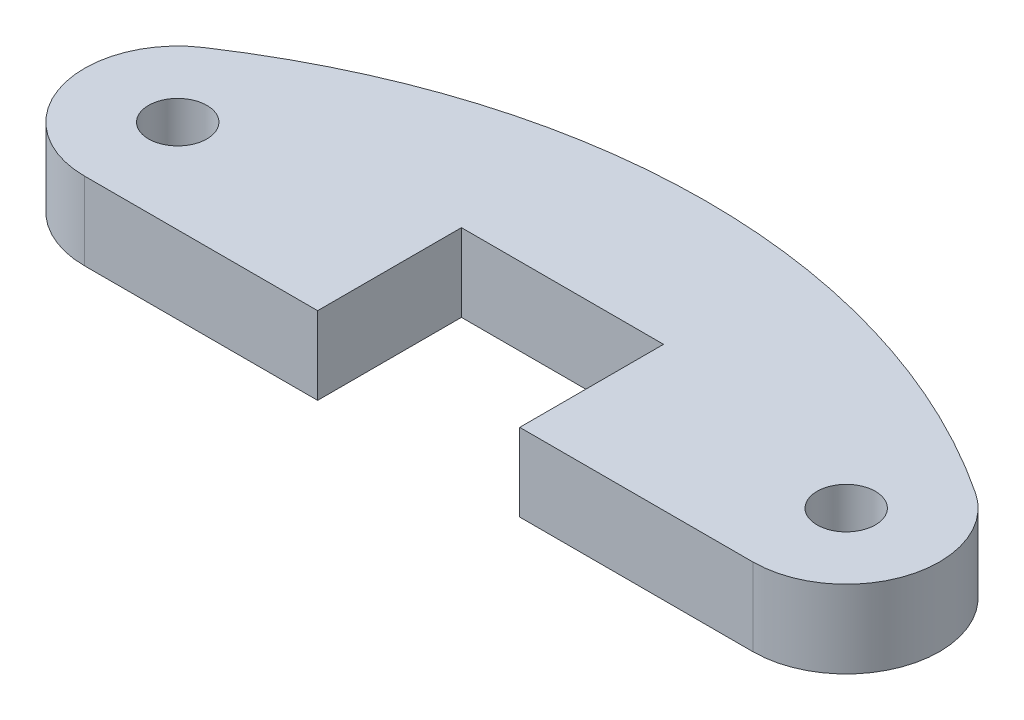
ISO-10303-21;
HEADER;
FILE_DESCRIPTION(('STEP AP214'),'2;1');
FILE_NAME('part.step','',(''),(''),'','','');
FILE_SCHEMA(('AUTOMOTIVE_DESIGN { 1 0 10303 214 1 1 1 1 }'));
ENDSEC;
DATA;
#1=APPLICATION_CONTEXT('core data for automotive mechanical design processes');
#2=APPLICATION_PROTOCOL_DEFINITION('international standard','automotive_design',2000,#1);
#3=PRODUCT_CONTEXT('',#1,'mechanical');
#4=PRODUCT('Part','Part','',(#3));
#5=PRODUCT_RELATED_PRODUCT_CATEGORY('part','',(#4));
#6=PRODUCT_DEFINITION_FORMATION('','',#4);
#7=PRODUCT_DEFINITION_CONTEXT('part definition',#1,'design');
#8=PRODUCT_DEFINITION('design','',#6,#7);
#9=PRODUCT_DEFINITION_SHAPE('','',#8);
#10=(LENGTH_UNIT() NAMED_UNIT(*) SI_UNIT(.MILLI.,.METRE.));
#11=(NAMED_UNIT(*) PLANE_ANGLE_UNIT() SI_UNIT($,.RADIAN.));
#12=(NAMED_UNIT(*) SI_UNIT($,.STERADIAN.) SOLID_ANGLE_UNIT());
#13=UNCERTAINTY_MEASURE_WITH_UNIT(LENGTH_MEASURE(1.E-05),#10,'distance_accuracy_value','');
#14=(GEOMETRIC_REPRESENTATION_CONTEXT(3) GLOBAL_UNCERTAINTY_ASSIGNED_CONTEXT((#13)) GLOBAL_UNIT_ASSIGNED_CONTEXT((#10,
#11,#12)) REPRESENTATION_CONTEXT('',''));
#15=CARTESIAN_POINT('',(0.,0.,0.));
#16=DIRECTION('',(0.,0.,1.));
#17=DIRECTION('',(1.,0.,0.));
#18=AXIS2_PLACEMENT_3D('',#15,#16,#17);
#19=CARTESIAN_POINT('',(21.5,5.,0.));
#20=DIRECTION('',(0.,1.,0.));
#21=DIRECTION('',(0.,0.,1.));
#22=AXIS2_PLACEMENT_3D('',#19,#20,#21);
#23=PLANE('',#22);
#24=CARTESIAN_POINT('',(-21.5,5.,0.));
#25=DIRECTION('',(0.,1.,0.));
#26=DIRECTION('',(0.,0.,1.));
#27=AXIS2_PLACEMENT_3D('',#24,#25,#26);
#28=CIRCLE('',#27,1.875);
#29=CARTESIAN_POINT('',(-21.5,5.,1.87500000000003));
#30=VERTEX_POINT('',#29);
#31=EDGE_CURVE('E146',#30,#30,#28,.T.);
#32=ORIENTED_EDGE('',*,*,#31,.F.);
#33=EDGE_LOOP('',(#32));
#34=FACE_BOUND('',#33,.T.);
#35=CARTESIAN_POINT('',(21.5,5.,0.));
#36=DIRECTION('',(0.,1.,0.));
#37=DIRECTION('',(0.,0.,1.));
#38=AXIS2_PLACEMENT_3D('',#35,#36,#37);
#39=CIRCLE('',#38,6.00000000000001);
#40=CARTESIAN_POINT('',(21.5,5.,6.00000000000002));
#41=VERTEX_POINT('',#40);
#42=CARTESIAN_POINT('',(24.8166247903554,5.,-5.));
#43=VERTEX_POINT('',#42);
#44=EDGE_CURVE('E170',#41,#43,#39,.T.);
#45=ORIENTED_EDGE('',*,*,#44,.T.);
#46=CARTESIAN_POINT('',(24.8166247903554,5.,-5.));
#47=CARTESIAN_POINT('',(10.3785852581471,5.,-14.5771119673307));
#48=CARTESIAN_POINT('',(-8.73629512344241,5.,-15.6664840020742));
#49=CARTESIAN_POINT('',(-24.8166247903554,5.,-5.));
#50=B_SPLINE_CURVE_WITH_KNOTS('',3,(#46,#47,#48,#49),.UNSPECIFIED.,.F.,.F.,(4,4),(0.,1.),.UNSPECIFIED.);
#51=CARTESIAN_POINT('',(-24.8166247903554,5.,-4.99999999999999));
#52=VERTEX_POINT('',#51);
#53=EDGE_CURVE('E99',#43,#52,#50,.T.);
#54=ORIENTED_EDGE('',*,*,#53,.T.);
#55=CARTESIAN_POINT('',(-21.5,5.,0.));
#56=DIRECTION('',(0.,1.,0.));
#57=DIRECTION('',(0.,0.,1.));
#58=AXIS2_PLACEMENT_3D('',#55,#56,#57);
#59=CIRCLE('',#58,6.00000000000001);
#60=CARTESIAN_POINT('',(-21.5,5.,6.00000000000003));
#61=VERTEX_POINT('',#60);
#62=EDGE_CURVE('E191',#52,#61,#59,.T.);
#63=ORIENTED_EDGE('',*,*,#62,.T.);
#64=DIRECTION('',(1.,0.,0.));
#65=VECTOR('',#64,1.);
#66=CARTESIAN_POINT('',(-6.5,5.,6.00000000000002));
#67=LINE('',#66,#65);
#68=CARTESIAN_POINT('',(-6.5,5.,6.00000000000002));
#69=VERTEX_POINT('',#68);
#70=EDGE_CURVE('E204',#61,#69,#67,.T.);
#71=ORIENTED_EDGE('',*,*,#70,.T.);
#72=DIRECTION('',(0.,0.,-1.));
#73=VECTOR('',#72,1.);
#74=CARTESIAN_POINT('',(-6.5,5.,3.25));
#75=LINE('',#74,#73);
#76=CARTESIAN_POINT('',(-6.5,5.,-3.25));
#77=VERTEX_POINT('',#76);
#78=EDGE_CURVE('E118',#69,#77,#75,.T.);
#79=ORIENTED_EDGE('',*,*,#78,.T.);
#80=DIRECTION('',(1.,0.,0.));
#81=VECTOR('',#80,1.);
#82=CARTESIAN_POINT('',(6.5,5.,-3.25));
#83=LINE('',#82,#81);
#84=CARTESIAN_POINT('',(6.5,5.,-3.25));
#85=VERTEX_POINT('',#84);
#86=EDGE_CURVE('E112',#77,#85,#83,.T.);
#87=ORIENTED_EDGE('',*,*,#86,.T.);
#88=DIRECTION('',(0.,0.,1.));
#89=VECTOR('',#88,1.);
#90=CARTESIAN_POINT('',(6.5,5.,3.25));
#91=LINE('',#90,#89);
#92=CARTESIAN_POINT('',(6.5,5.,6.00000000000002));
#93=VERTEX_POINT('',#92);
#94=EDGE_CURVE('E116',#85,#93,#91,.T.);
#95=ORIENTED_EDGE('',*,*,#94,.T.);
#96=DIRECTION('',(1.,0.,0.));
#97=VECTOR('',#96,1.);
#98=CARTESIAN_POINT('',(21.5,5.,6.00000000000002));
#99=LINE('',#98,#97);
#100=EDGE_CURVE('E57',#93,#41,#99,.T.);
#101=ORIENTED_EDGE('',*,*,#100,.T.);
#102=EDGE_LOOP('',(#45,#54,#63,#71,#79,#87,#95,#101));
#103=FACE_BOUND('',#102,.T.);
#104=CARTESIAN_POINT('',(21.5,5.,0.));
#105=DIRECTION('',(0.,1.,0.));
#106=DIRECTION('',(0.,0.,-1.));
#107=AXIS2_PLACEMENT_3D('',#104,#105,#106);
#108=CIRCLE('',#107,1.875);
#109=CARTESIAN_POINT('',(21.5,5.,-1.87499999999997));
#110=VERTEX_POINT('',#109);
#111=EDGE_CURVE('E252',#110,#110,#108,.T.);
#112=ORIENTED_EDGE('',*,*,#111,.F.);
#113=EDGE_LOOP('',(#112));
#114=FACE_BOUND('',#113,.T.);
#115=ADVANCED_FACE('F39',(#34,#103,#114),#23,.T.);
#116=CARTESIAN_POINT('',(21.5,0.,0.));
#117=DIRECTION('',(0.,1.,0.));
#118=DIRECTION('',(0.,0.,1.));
#119=AXIS2_PLACEMENT_3D('',#116,#117,#118);
#120=PLANE('',#119);
#121=CARTESIAN_POINT('',(21.5,0.,0.));
#122=DIRECTION('',(0.,1.,0.));
#123=DIRECTION('',(0.,0.,1.));
#124=AXIS2_PLACEMENT_3D('',#121,#122,#123);
#125=CIRCLE('',#124,6.00000000000001);
#126=CARTESIAN_POINT('',(21.5,0.,6.00000000000002));
#127=VERTEX_POINT('',#126);
#128=CARTESIAN_POINT('',(24.8166247903554,0.,-5.));
#129=VERTEX_POINT('',#128);
#130=EDGE_CURVE('E141',#127,#129,#125,.T.);
#131=ORIENTED_EDGE('',*,*,#130,.F.);
#132=DIRECTION('',(1.,0.,0.));
#133=VECTOR('',#132,1.);
#134=CARTESIAN_POINT('',(21.5,0.,6.00000000000002));
#135=LINE('',#134,#133);
#136=CARTESIAN_POINT('',(6.5,0.,6.00000000000002));
#137=VERTEX_POINT('',#136);
#138=EDGE_CURVE('E91',#137,#127,#135,.T.);
#139=ORIENTED_EDGE('',*,*,#138,.F.);
#140=DIRECTION('',(0.,0.,1.));
#141=VECTOR('',#140,1.);
#142=CARTESIAN_POINT('',(6.5,0.,3.25));
#143=LINE('',#142,#141);
#144=CARTESIAN_POINT('',(6.5,0.,-3.25));
#145=VERTEX_POINT('',#144);
#146=EDGE_CURVE('E85',#145,#137,#143,.T.);
#147=ORIENTED_EDGE('',*,*,#146,.F.);
#148=DIRECTION('',(1.,0.,0.));
#149=VECTOR('',#148,1.);
#150=CARTESIAN_POINT('',(6.5,0.,-3.25));
#151=LINE('',#150,#149);
#152=CARTESIAN_POINT('',(-6.5,0.,-3.25));
#153=VERTEX_POINT('',#152);
#154=EDGE_CURVE('E128',#153,#145,#151,.T.);
#155=ORIENTED_EDGE('',*,*,#154,.F.);
#156=DIRECTION('',(0.,0.,-1.));
#157=VECTOR('',#156,1.);
#158=CARTESIAN_POINT('',(-6.5,0.,3.25));
#159=LINE('',#158,#157);
#160=CARTESIAN_POINT('',(-6.5,0.,6.00000000000002));
#161=VERTEX_POINT('',#160);
#162=EDGE_CURVE('E161',#161,#153,#159,.T.);
#163=ORIENTED_EDGE('',*,*,#162,.F.);
#164=DIRECTION('',(1.,0.,0.));
#165=VECTOR('',#164,1.);
#166=CARTESIAN_POINT('',(-6.5,0.,6.00000000000002));
#167=LINE('',#166,#165);
#168=CARTESIAN_POINT('',(-21.5,0.,6.00000000000003));
#169=VERTEX_POINT('',#168);
#170=EDGE_CURVE('E157',#169,#161,#167,.T.);
#171=ORIENTED_EDGE('',*,*,#170,.F.);
#172=CARTESIAN_POINT('',(-21.5,0.,0.));
#173=DIRECTION('',(0.,1.,0.));
#174=DIRECTION('',(0.,0.,1.));
#175=AXIS2_PLACEMENT_3D('',#172,#173,#174);
#176=CIRCLE('',#175,6.00000000000001);
#177=CARTESIAN_POINT('',(-24.8166247903554,0.,-4.99999999999999));
#178=VERTEX_POINT('',#177);
#179=EDGE_CURVE('E151',#178,#169,#176,.T.);
#180=ORIENTED_EDGE('',*,*,#179,.F.);
#181=CARTESIAN_POINT('',(24.8166247903554,0.,-5.));
#182=CARTESIAN_POINT('',(10.3785852581471,0.,-14.5771119673307));
#183=CARTESIAN_POINT('',(-8.73629512344241,0.,-15.6664840020742));
#184=CARTESIAN_POINT('',(-24.8166247903554,0.,-5.));
#185=B_SPLINE_CURVE_WITH_KNOTS('',3,(#181,#182,#183,#184),.UNSPECIFIED.,.F.,.F.,(4,4),(0.,1.),.UNSPECIFIED.);
#186=EDGE_CURVE('E145',#129,#178,#185,.T.);
#187=ORIENTED_EDGE('',*,*,#186,.F.);
#188=EDGE_LOOP('',(#131,#139,#147,#155,#163,#171,#180,#187));
#189=FACE_BOUND('',#188,.T.);
#190=CARTESIAN_POINT('',(-21.5,0.,0.));
#191=DIRECTION('',(0.,1.,0.));
#192=DIRECTION('',(0.,0.,1.));
#193=AXIS2_PLACEMENT_3D('',#190,#191,#192);
#194=CIRCLE('',#193,1.875);
#195=CARTESIAN_POINT('',(-21.5,0.,1.87500000000003));
#196=VERTEX_POINT('',#195);
#197=EDGE_CURVE('E260',#196,#196,#194,.T.);
#198=ORIENTED_EDGE('',*,*,#197,.T.);
#199=EDGE_LOOP('',(#198));
#200=FACE_BOUND('',#199,.T.);
#201=CARTESIAN_POINT('',(21.5,0.,0.));
#202=DIRECTION('',(0.,1.,0.));
#203=DIRECTION('',(0.,0.,-1.));
#204=AXIS2_PLACEMENT_3D('',#201,#202,#203);
#205=CIRCLE('',#204,1.875);
#206=CARTESIAN_POINT('',(21.5,0.,-1.87499999999997));
#207=VERTEX_POINT('',#206);
#208=EDGE_CURVE('E255',#207,#207,#205,.T.);
#209=ORIENTED_EDGE('',*,*,#208,.T.);
#210=EDGE_LOOP('',(#209));
#211=FACE_BOUND('',#210,.T.);
#212=ADVANCED_FACE('F195',(#189,#200,#211),#120,.F.);
#213=CARTESIAN_POINT('',(21.5,5.,0.));
#214=DIRECTION('',(0.,-1.,0.));
#215=DIRECTION('',(0.,0.,-1.));
#216=AXIS2_PLACEMENT_3D('',#213,#214,#215);
#217=CYLINDRICAL_SURFACE('',#216,6.00000000000001);
#218=ORIENTED_EDGE('',*,*,#130,.T.);
#219=DIRECTION('',(0.,-1.,0.));
#220=VECTOR('',#219,1.);
#221=CARTESIAN_POINT('',(24.8166247903554,5.,-5.));
#222=LINE('',#221,#220);
#223=EDGE_CURVE('E11',#43,#129,#222,.T.);
#224=ORIENTED_EDGE('',*,*,#223,.F.);
#225=ORIENTED_EDGE('',*,*,#44,.F.);
#226=DIRECTION('',(0.,-1.,0.));
#227=VECTOR('',#226,1.);
#228=CARTESIAN_POINT('',(21.5,5.,6.00000000000002));
#229=LINE('',#228,#227);
#230=EDGE_CURVE('E137',#41,#127,#229,.T.);
#231=ORIENTED_EDGE('',*,*,#230,.T.);
#232=EDGE_LOOP('',(#218,#224,#225,#231));
#233=FACE_BOUND('',#232,.T.);
#234=ADVANCED_FACE('F41',(#233),#217,.T.);
#235=DIRECTION('',(0.,-1.,0.));
#236=VECTOR('',#235,1.);
#237=SURFACE_OF_LINEAR_EXTRUSION('',#50,#236);
#238=ORIENTED_EDGE('',*,*,#186,.T.);
#239=DIRECTION('',(0.,-1.,0.));
#240=VECTOR('',#239,1.);
#241=CARTESIAN_POINT('',(-24.8166247903554,5.,-4.99999999999999));
#242=LINE('',#241,#240);
#243=EDGE_CURVE('E49',#52,#178,#242,.T.);
#244=ORIENTED_EDGE('',*,*,#243,.F.);
#245=ORIENTED_EDGE('',*,*,#53,.F.);
#246=ORIENTED_EDGE('',*,*,#223,.T.);
#247=EDGE_LOOP('',(#238,#244,#245,#246));
#248=FACE_BOUND('',#247,.T.);
#249=ADVANCED_FACE('F219',(#248),#237,.F.);
#250=CARTESIAN_POINT('',(-21.5,5.,0.));
#251=DIRECTION('',(0.,-1.,0.));
#252=DIRECTION('',(0.,0.,-1.));
#253=AXIS2_PLACEMENT_3D('',#250,#251,#252);
#254=CYLINDRICAL_SURFACE('',#253,6.00000000000001);
#255=ORIENTED_EDGE('',*,*,#179,.T.);
#256=DIRECTION('',(0.,-1.,0.));
#257=VECTOR('',#256,1.);
#258=CARTESIAN_POINT('',(-21.5,5.,6.00000000000003));
#259=LINE('',#258,#257);
#260=EDGE_CURVE('E181',#61,#169,#259,.T.);
#261=ORIENTED_EDGE('',*,*,#260,.F.);
#262=ORIENTED_EDGE('',*,*,#62,.F.);
#263=ORIENTED_EDGE('',*,*,#243,.T.);
#264=EDGE_LOOP('',(#255,#261,#262,#263));
#265=FACE_BOUND('',#264,.T.);
#266=ADVANCED_FACE('F189',(#265),#254,.T.);
#267=CARTESIAN_POINT('',(-6.5,5.,6.00000000000002));
#268=DIRECTION('',(0.,0.,-1.));
#269=DIRECTION('',(-1.,0.,0.));
#270=AXIS2_PLACEMENT_3D('',#267,#268,#269);
#271=PLANE('',#270);
#272=ORIENTED_EDGE('',*,*,#170,.T.);
#273=DIRECTION('',(0.,-1.,0.));
#274=VECTOR('',#273,1.);
#275=CARTESIAN_POINT('',(-6.5,5.,6.00000000000002));
#276=LINE('',#275,#274);
#277=EDGE_CURVE('E177',#69,#161,#276,.T.);
#278=ORIENTED_EDGE('',*,*,#277,.F.);
#279=ORIENTED_EDGE('',*,*,#70,.F.);
#280=ORIENTED_EDGE('',*,*,#260,.T.);
#281=EDGE_LOOP('',(#272,#278,#279,#280));
#282=FACE_BOUND('',#281,.T.);
#283=ADVANCED_FACE('F199',(#282),#271,.F.);
#284=CARTESIAN_POINT('',(-6.5,5.,3.25));
#285=DIRECTION('',(-1.,0.,0.));
#286=DIRECTION('',(0.,0.,1.));
#287=AXIS2_PLACEMENT_3D('',#284,#285,#286);
#288=PLANE('',#287);
#289=ORIENTED_EDGE('',*,*,#162,.T.);
#290=DIRECTION('',(0.,-1.,0.));
#291=VECTOR('',#290,1.);
#292=CARTESIAN_POINT('',(-6.5,5.,-3.25));
#293=LINE('',#292,#291);
#294=EDGE_CURVE('E130',#77,#153,#293,.T.);
#295=ORIENTED_EDGE('',*,*,#294,.F.);
#296=ORIENTED_EDGE('',*,*,#78,.F.);
#297=ORIENTED_EDGE('',*,*,#277,.T.);
#298=EDGE_LOOP('',(#289,#295,#296,#297));
#299=FACE_BOUND('',#298,.T.);
#300=ADVANCED_FACE('F202',(#299),#288,.F.);
#301=CARTESIAN_POINT('',(6.5,5.,-3.25));
#302=DIRECTION('',(0.,0.,-1.));
#303=DIRECTION('',(-1.,0.,0.));
#304=AXIS2_PLACEMENT_3D('',#301,#302,#303);
#305=PLANE('',#304);
#306=ORIENTED_EDGE('',*,*,#154,.T.);
#307=DIRECTION('',(0.,-1.,0.));
#308=VECTOR('',#307,1.);
#309=CARTESIAN_POINT('',(6.5,5.,-3.25));
#310=LINE('',#309,#308);
#311=EDGE_CURVE('E125',#85,#145,#310,.T.);
#312=ORIENTED_EDGE('',*,*,#311,.F.);
#313=ORIENTED_EDGE('',*,*,#86,.F.);
#314=ORIENTED_EDGE('',*,*,#294,.T.);
#315=EDGE_LOOP('',(#306,#312,#313,#314));
#316=FACE_BOUND('',#315,.T.);
#317=ADVANCED_FACE('F126',(#316),#305,.F.);
#318=CARTESIAN_POINT('',(6.5,5.,3.25));
#319=DIRECTION('',(1.,0.,0.));
#320=DIRECTION('',(0.,0.,-1.));
#321=AXIS2_PLACEMENT_3D('',#318,#319,#320);
#322=PLANE('',#321);
#323=ORIENTED_EDGE('',*,*,#146,.T.);
#324=DIRECTION('',(0.,-1.,0.));
#325=VECTOR('',#324,1.);
#326=CARTESIAN_POINT('',(6.5,5.,6.00000000000002));
#327=LINE('',#326,#325);
#328=EDGE_CURVE('E131',#93,#137,#327,.T.);
#329=ORIENTED_EDGE('',*,*,#328,.F.);
#330=ORIENTED_EDGE('',*,*,#94,.F.);
#331=ORIENTED_EDGE('',*,*,#311,.T.);
#332=EDGE_LOOP('',(#323,#329,#330,#331));
#333=FACE_BOUND('',#332,.T.);
#334=ADVANCED_FACE('F133',(#333),#322,.F.);
#335=CARTESIAN_POINT('',(21.5,5.,6.00000000000002));
#336=DIRECTION('',(0.,0.,-1.));
#337=DIRECTION('',(-1.,0.,0.));
#338=AXIS2_PLACEMENT_3D('',#335,#336,#337);
#339=PLANE('',#338);
#340=ORIENTED_EDGE('',*,*,#138,.T.);
#341=ORIENTED_EDGE('',*,*,#230,.F.);
#342=ORIENTED_EDGE('',*,*,#100,.F.);
#343=ORIENTED_EDGE('',*,*,#328,.T.);
#344=EDGE_LOOP('',(#340,#341,#342,#343));
#345=FACE_BOUND('',#344,.T.);
#346=ADVANCED_FACE('F232',(#345),#339,.F.);
#347=CARTESIAN_POINT('',(-21.5,5.,0.));
#348=DIRECTION('',(0.,-1.,0.));
#349=DIRECTION('',(0.,0.,-1.));
#350=AXIS2_PLACEMENT_3D('',#347,#348,#349);
#351=CYLINDRICAL_SURFACE('',#350,1.875);
#352=ORIENTED_EDGE('',*,*,#31,.T.);
#353=EDGE_LOOP('',(#352));
#354=FACE_BOUND('',#353,.T.);
#355=ORIENTED_EDGE('',*,*,#197,.F.);
#356=EDGE_LOOP('',(#355));
#357=FACE_BOUND('',#356,.T.);
#358=ADVANCED_FACE('F235',(#354,#357),#351,.F.);
#359=CARTESIAN_POINT('',(21.5,5.,0.));
#360=DIRECTION('',(0.,-1.,0.));
#361=DIRECTION('',(0.,0.,-1.));
#362=AXIS2_PLACEMENT_3D('',#359,#360,#361);
#363=CYLINDRICAL_SURFACE('',#362,1.875);
#364=ORIENTED_EDGE('',*,*,#111,.T.);
#365=EDGE_LOOP('',(#364));
#366=FACE_BOUND('',#365,.T.);
#367=ORIENTED_EDGE('',*,*,#208,.F.);
#368=EDGE_LOOP('',(#367));
#369=FACE_BOUND('',#368,.T.);
#370=ADVANCED_FACE('F243',(#366,#369),#363,.F.);
#371=CLOSED_SHELL('',(#115,#212,#234,#249,#266,#283,#300,#317,#334,#346,#358,#370));
#372=MANIFOLD_SOLID_BREP('B2',#371);
#373=ADVANCED_BREP_SHAPE_REPRESENTATION('',(#18,#372),#14);
#374=SHAPE_DEFINITION_REPRESENTATION(#9,#373);
ENDSEC;
END-ISO-10303-21;
